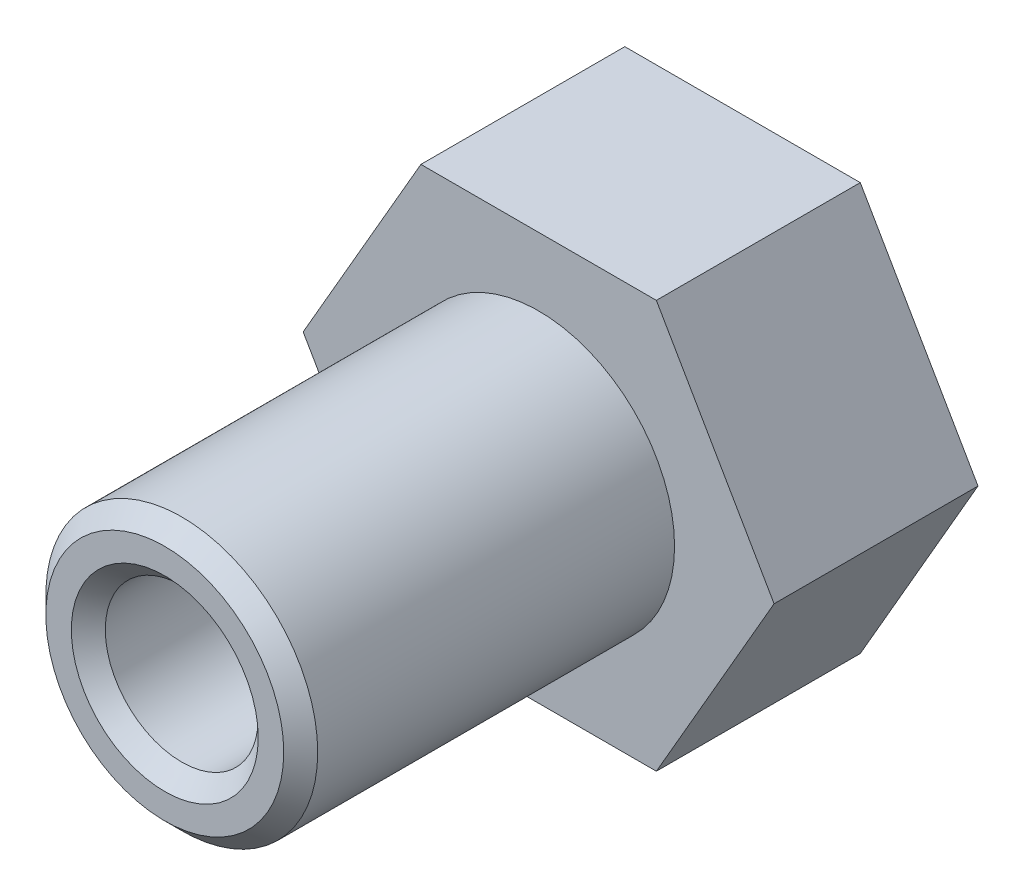
ISO-10303-21;
HEADER;
FILE_DESCRIPTION(('STEP AP214'),'2;1');
FILE_NAME('part.step','',(''),(''),'','','');
FILE_SCHEMA(('AUTOMOTIVE_DESIGN { 1 0 10303 214 1 1 1 1 }'));
ENDSEC;
DATA;
#1=APPLICATION_CONTEXT('core data for automotive mechanical design processes');
#2=APPLICATION_PROTOCOL_DEFINITION('international standard','automotive_design',2000,#1);
#3=PRODUCT_CONTEXT('',#1,'mechanical');
#4=PRODUCT('Part','Part','',(#3));
#5=PRODUCT_RELATED_PRODUCT_CATEGORY('part','',(#4));
#6=PRODUCT_DEFINITION_FORMATION('','',#4);
#7=PRODUCT_DEFINITION_CONTEXT('part definition',#1,'design');
#8=PRODUCT_DEFINITION('design','',#6,#7);
#9=PRODUCT_DEFINITION_SHAPE('','',#8);
#10=(LENGTH_UNIT() NAMED_UNIT(*) SI_UNIT(.MILLI.,.METRE.));
#11=(NAMED_UNIT(*) PLANE_ANGLE_UNIT() SI_UNIT($,.RADIAN.));
#12=(NAMED_UNIT(*) SI_UNIT($,.STERADIAN.) SOLID_ANGLE_UNIT());
#13=UNCERTAINTY_MEASURE_WITH_UNIT(LENGTH_MEASURE(1.E-05),#10,'distance_accuracy_value','');
#14=(GEOMETRIC_REPRESENTATION_CONTEXT(3) GLOBAL_UNCERTAINTY_ASSIGNED_CONTEXT((#13)) GLOBAL_UNIT_ASSIGNED_CONTEXT((#10,
#11,#12)) REPRESENTATION_CONTEXT('',''));
#15=CARTESIAN_POINT('',(0.,0.,0.));
#16=DIRECTION('',(0.,0.,1.));
#17=DIRECTION('',(1.,0.,0.));
#18=AXIS2_PLACEMENT_3D('',#15,#16,#17);
#19=CARTESIAN_POINT('',(-6.9282032302755,-12.,12.));
#20=DIRECTION('',(0.,0.,1.));
#21=DIRECTION('',(1.,0.,0.));
#22=AXIS2_PLACEMENT_3D('',#19,#20,#21);
#23=PLANE('',#22);
#24=DIRECTION('',(0.5,-0.866025403784438,0.));
#25=VECTOR('',#24,1.);
#26=CARTESIAN_POINT('',(-13.856406460551,0.,12.));
#27=LINE('',#26,#25);
#28=CARTESIAN_POINT('',(-13.856406460551,0.,12.));
#29=VERTEX_POINT('',#28);
#30=CARTESIAN_POINT('',(-6.9282032302755,-12.,12.));
#31=VERTEX_POINT('',#30);
#32=EDGE_CURVE('E131',#29,#31,#27,.T.);
#33=ORIENTED_EDGE('',*,*,#32,.T.);
#34=DIRECTION('',(1.,0.,0.));
#35=VECTOR('',#34,1.);
#36=CARTESIAN_POINT('',(-6.9282032302755,-12.,12.));
#37=LINE('',#36,#35);
#38=CARTESIAN_POINT('',(6.92820323027551,-12.,12.));
#39=VERTEX_POINT('',#38);
#40=EDGE_CURVE('E89',#31,#39,#37,.T.);
#41=ORIENTED_EDGE('',*,*,#40,.T.);
#42=DIRECTION('',(0.5,0.866025403784438,0.));
#43=VECTOR('',#42,1.);
#44=CARTESIAN_POINT('',(6.92820323027551,-12.,12.));
#45=LINE('',#44,#43);
#46=CARTESIAN_POINT('',(13.856406460551,0.,12.));
#47=VERTEX_POINT('',#46);
#48=EDGE_CURVE('E102',#39,#47,#45,.T.);
#49=ORIENTED_EDGE('',*,*,#48,.T.);
#50=DIRECTION('',(-0.5,0.866025403784438,0.));
#51=VECTOR('',#50,1.);
#52=CARTESIAN_POINT('',(13.856406460551,0.,12.));
#53=LINE('',#52,#51);
#54=CARTESIAN_POINT('',(6.9282032302755,12.,12.));
#55=VERTEX_POINT('',#54);
#56=EDGE_CURVE('E96',#47,#55,#53,.T.);
#57=ORIENTED_EDGE('',*,*,#56,.T.);
#58=DIRECTION('',(-1.,0.,0.));
#59=VECTOR('',#58,1.);
#60=CARTESIAN_POINT('',(6.9282032302755,12.,12.));
#61=LINE('',#60,#59);
#62=CARTESIAN_POINT('',(-6.92820323027551,12.,12.));
#63=VERTEX_POINT('',#62);
#64=EDGE_CURVE('E100',#55,#63,#61,.T.);
#65=ORIENTED_EDGE('',*,*,#64,.T.);
#66=DIRECTION('',(-0.5,-0.866025403784439,0.));
#67=VECTOR('',#66,1.);
#68=CARTESIAN_POINT('',(-6.92820323027551,12.,12.));
#69=LINE('',#68,#67);
#70=EDGE_CURVE('E51',#63,#29,#69,.T.);
#71=ORIENTED_EDGE('',*,*,#70,.T.);
#72=EDGE_LOOP('',(#33,#41,#49,#57,#65,#71));
#73=FACE_BOUND('',#72,.T.);
#74=CARTESIAN_POINT('',(0.,0.,12.));
#75=DIRECTION('',(0.,0.,1.));
#76=DIRECTION('',(1.,0.,0.));
#77=AXIS2_PLACEMENT_3D('',#74,#75,#76);
#78=CIRCLE('',#77,8.);
#79=CARTESIAN_POINT('',(8.,0.,12.));
#80=VERTEX_POINT('',#79);
#81=EDGE_CURVE('E124',#80,#80,#78,.T.);
#82=ORIENTED_EDGE('',*,*,#81,.F.);
#83=EDGE_LOOP('',(#82));
#84=FACE_BOUND('',#83,.T.);
#85=ADVANCED_FACE('F34',(#73,#84),#23,.T.);
#86=CARTESIAN_POINT('',(-13.856406460551,0.,12.));
#87=DIRECTION('',(0.866025403784439,0.5,0.));
#88=DIRECTION('',(-0.5,0.866025403784439,0.));
#89=AXIS2_PLACEMENT_3D('',#86,#87,#88);
#90=PLANE('',#89);
#91=DIRECTION('',(0.5,-0.866025403784438,0.));
#92=VECTOR('',#91,1.);
#93=CARTESIAN_POINT('',(-13.856406460551,0.,0.));
#94=LINE('',#93,#92);
#95=CARTESIAN_POINT('',(-13.856406460551,0.,0.));
#96=VERTEX_POINT('',#95);
#97=CARTESIAN_POINT('',(-6.9282032302755,-12.,0.));
#98=VERTEX_POINT('',#97);
#99=EDGE_CURVE('E120',#96,#98,#94,.T.);
#100=ORIENTED_EDGE('',*,*,#99,.T.);
#101=DIRECTION('',(0.,0.,-1.));
#102=VECTOR('',#101,1.);
#103=CARTESIAN_POINT('',(-6.9282032302755,-12.,12.));
#104=LINE('',#103,#102);
#105=EDGE_CURVE('E138',#31,#98,#104,.T.);
#106=ORIENTED_EDGE('',*,*,#105,.F.);
#107=ORIENTED_EDGE('',*,*,#32,.F.);
#108=DIRECTION('',(0.,0.,-1.));
#109=VECTOR('',#108,1.);
#110=CARTESIAN_POINT('',(-13.856406460551,0.,12.));
#111=LINE('',#110,#109);
#112=EDGE_CURVE('E116',#29,#96,#111,.T.);
#113=ORIENTED_EDGE('',*,*,#112,.T.);
#114=EDGE_LOOP('',(#100,#106,#107,#113));
#115=FACE_BOUND('',#114,.T.);
#116=ADVANCED_FACE('F161',(#115),#90,.F.);
#117=CARTESIAN_POINT('',(-6.9282032302755,-12.,12.));
#118=DIRECTION('',(0.,1.,0.));
#119=DIRECTION('',(-1.,0.,0.));
#120=AXIS2_PLACEMENT_3D('',#117,#118,#119);
#121=PLANE('',#120);
#122=DIRECTION('',(1.,0.,0.));
#123=VECTOR('',#122,1.);
#124=CARTESIAN_POINT('',(-6.9282032302755,-12.,0.));
#125=LINE('',#124,#123);
#126=CARTESIAN_POINT('',(6.92820323027551,-12.,0.));
#127=VERTEX_POINT('',#126);
#128=EDGE_CURVE('E123',#98,#127,#125,.T.);
#129=ORIENTED_EDGE('',*,*,#128,.T.);
#130=DIRECTION('',(0.,0.,-1.));
#131=VECTOR('',#130,1.);
#132=CARTESIAN_POINT('',(6.92820323027551,-12.,12.));
#133=LINE('',#132,#131);
#134=EDGE_CURVE('E135',#39,#127,#133,.T.);
#135=ORIENTED_EDGE('',*,*,#134,.F.);
#136=ORIENTED_EDGE('',*,*,#40,.F.);
#137=ORIENTED_EDGE('',*,*,#105,.T.);
#138=EDGE_LOOP('',(#129,#135,#136,#137));
#139=FACE_BOUND('',#138,.T.);
#140=ADVANCED_FACE('F166',(#139),#121,.F.);
#141=CARTESIAN_POINT('',(6.92820323027551,-12.,12.));
#142=DIRECTION('',(-0.866025403784439,0.5,0.));
#143=DIRECTION('',(-0.5,-0.866025403784439,0.));
#144=AXIS2_PLACEMENT_3D('',#141,#142,#143);
#145=PLANE('',#144);
#146=DIRECTION('',(0.5,0.866025403784438,0.));
#147=VECTOR('',#146,1.);
#148=CARTESIAN_POINT('',(6.92820323027551,-12.,0.));
#149=LINE('',#148,#147);
#150=CARTESIAN_POINT('',(13.856406460551,0.,0.));
#151=VERTEX_POINT('',#150);
#152=EDGE_CURVE('E126',#127,#151,#149,.T.);
#153=ORIENTED_EDGE('',*,*,#152,.T.);
#154=DIRECTION('',(0.,0.,-1.));
#155=VECTOR('',#154,1.);
#156=CARTESIAN_POINT('',(13.856406460551,0.,12.));
#157=LINE('',#156,#155);
#158=EDGE_CURVE('E111',#47,#151,#157,.T.);
#159=ORIENTED_EDGE('',*,*,#158,.F.);
#160=ORIENTED_EDGE('',*,*,#48,.F.);
#161=ORIENTED_EDGE('',*,*,#134,.T.);
#162=EDGE_LOOP('',(#153,#159,#160,#161));
#163=FACE_BOUND('',#162,.T.);
#164=ADVANCED_FACE('F184',(#163),#145,.F.);
#165=CARTESIAN_POINT('',(13.856406460551,0.,12.));
#166=DIRECTION('',(-0.866025403784438,-0.5,0.));
#167=DIRECTION('',(0.5,-0.866025403784439,0.));
#168=AXIS2_PLACEMENT_3D('',#165,#166,#167);
#169=PLANE('',#168);
#170=DIRECTION('',(-0.5,0.866025403784438,0.));
#171=VECTOR('',#170,1.);
#172=CARTESIAN_POINT('',(13.856406460551,0.,0.));
#173=LINE('',#172,#171);
#174=CARTESIAN_POINT('',(6.9282032302755,12.,0.));
#175=VERTEX_POINT('',#174);
#176=EDGE_CURVE('E110',#151,#175,#173,.T.);
#177=ORIENTED_EDGE('',*,*,#176,.T.);
#178=DIRECTION('',(0.,0.,-1.));
#179=VECTOR('',#178,1.);
#180=CARTESIAN_POINT('',(6.9282032302755,12.,12.));
#181=LINE('',#180,#179);
#182=EDGE_CURVE('E107',#55,#175,#181,.T.);
#183=ORIENTED_EDGE('',*,*,#182,.F.);
#184=ORIENTED_EDGE('',*,*,#56,.F.);
#185=ORIENTED_EDGE('',*,*,#158,.T.);
#186=EDGE_LOOP('',(#177,#183,#184,#185));
#187=FACE_BOUND('',#186,.T.);
#188=ADVANCED_FACE('F108',(#187),#169,.F.);
#189=CARTESIAN_POINT('',(6.9282032302755,12.,12.));
#190=DIRECTION('',(0.,-1.,0.));
#191=DIRECTION('',(1.,0.,0.));
#192=AXIS2_PLACEMENT_3D('',#189,#190,#191);
#193=PLANE('',#192);
#194=DIRECTION('',(-1.,0.,0.));
#195=VECTOR('',#194,1.);
#196=CARTESIAN_POINT('',(6.9282032302755,12.,0.));
#197=LINE('',#196,#195);
#198=CARTESIAN_POINT('',(-6.92820323027551,12.,0.));
#199=VERTEX_POINT('',#198);
#200=EDGE_CURVE('E74',#175,#199,#197,.T.);
#201=ORIENTED_EDGE('',*,*,#200,.T.);
#202=DIRECTION('',(0.,0.,-1.));
#203=VECTOR('',#202,1.);
#204=CARTESIAN_POINT('',(-6.92820323027551,12.,12.));
#205=LINE('',#204,#203);
#206=EDGE_CURVE('E112',#63,#199,#205,.T.);
#207=ORIENTED_EDGE('',*,*,#206,.F.);
#208=ORIENTED_EDGE('',*,*,#64,.F.);
#209=ORIENTED_EDGE('',*,*,#182,.T.);
#210=EDGE_LOOP('',(#201,#207,#208,#209));
#211=FACE_BOUND('',#210,.T.);
#212=ADVANCED_FACE('F114',(#211),#193,.F.);
#213=CARTESIAN_POINT('',(-6.92820323027551,12.,12.));
#214=DIRECTION('',(0.866025403784438,-0.5,0.));
#215=DIRECTION('',(0.5,0.866025403784439,0.));
#216=AXIS2_PLACEMENT_3D('',#213,#214,#215);
#217=PLANE('',#216);
#218=DIRECTION('',(-0.5,-0.866025403784439,0.));
#219=VECTOR('',#218,1.);
#220=CARTESIAN_POINT('',(-6.92820323027551,12.,0.));
#221=LINE('',#220,#219);
#222=EDGE_CURVE('E80',#199,#96,#221,.T.);
#223=ORIENTED_EDGE('',*,*,#222,.T.);
#224=ORIENTED_EDGE('',*,*,#112,.F.);
#225=ORIENTED_EDGE('',*,*,#70,.F.);
#226=ORIENTED_EDGE('',*,*,#206,.T.);
#227=EDGE_LOOP('',(#223,#224,#225,#226));
#228=FACE_BOUND('',#227,.T.);
#229=ADVANCED_FACE('F176',(#228),#217,.F.);
#230=CARTESIAN_POINT('',(-6.9282032302755,-12.,0.));
#231=DIRECTION('',(0.,0.,1.));
#232=DIRECTION('',(1.,0.,0.));
#233=AXIS2_PLACEMENT_3D('',#230,#231,#232);
#234=PLANE('',#233);
#235=CARTESIAN_POINT('',(0.,0.,0.));
#236=DIRECTION('',(0.,0.,-1.));
#237=DIRECTION('',(-1.,0.,0.));
#238=AXIS2_PLACEMENT_3D('',#235,#236,#237);
#239=CIRCLE('',#238,4.5);
#240=CARTESIAN_POINT('',(-4.5,0.,0.));
#241=VERTEX_POINT('',#240);
#242=EDGE_CURVE('E201',#241,#241,#239,.T.);
#243=ORIENTED_EDGE('',*,*,#242,.F.);
#244=EDGE_LOOP('',(#243));
#245=FACE_BOUND('',#244,.T.);
#246=ORIENTED_EDGE('',*,*,#99,.F.);
#247=ORIENTED_EDGE('',*,*,#222,.F.);
#248=ORIENTED_EDGE('',*,*,#200,.F.);
#249=ORIENTED_EDGE('',*,*,#176,.F.);
#250=ORIENTED_EDGE('',*,*,#152,.F.);
#251=ORIENTED_EDGE('',*,*,#128,.F.);
#252=EDGE_LOOP('',(#246,#247,#248,#249,#250,#251));
#253=FACE_BOUND('',#252,.T.);
#254=ADVANCED_FACE('F173',(#245,#253),#234,.F.);
#255=CARTESIAN_POINT('',(0.,0.,34.));
#256=DIRECTION('',(0.,0.,-1.));
#257=DIRECTION('',(-1.,0.,0.));
#258=AXIS2_PLACEMENT_3D('',#255,#256,#257);
#259=CYLINDRICAL_SURFACE('',#258,8.);
#260=CARTESIAN_POINT('',(0.,0.,33.));
#261=DIRECTION('',(0.,0.,1.));
#262=DIRECTION('',(1.,0.,0.));
#263=AXIS2_PLACEMENT_3D('',#260,#261,#262);
#264=CIRCLE('',#263,8.);
#265=CARTESIAN_POINT('',(8.,0.,33.));
#266=VERTEX_POINT('',#265);
#267=EDGE_CURVE('E143',#266,#266,#264,.F.);
#268=ORIENTED_EDGE('',*,*,#267,.T.);
#269=EDGE_LOOP('',(#268));
#270=FACE_BOUND('',#269,.T.);
#271=ORIENTED_EDGE('',*,*,#81,.T.);
#272=EDGE_LOOP('',(#271));
#273=FACE_BOUND('',#272,.T.);
#274=ADVANCED_FACE('F171',(#270,#273),#259,.T.);
#275=CARTESIAN_POINT('',(0.,0.,34.));
#276=DIRECTION('',(0.,0.,1.));
#277=DIRECTION('',(1.,0.,0.));
#278=AXIS2_PLACEMENT_3D('',#275,#276,#277);
#279=PLANE('',#278);
#280=CARTESIAN_POINT('',(0.,0.,34.));
#281=DIRECTION('',(0.,0.,1.));
#282=DIRECTION('',(1.,0.,0.));
#283=AXIS2_PLACEMENT_3D('',#280,#281,#282);
#284=CIRCLE('',#283,5.5);
#285=CARTESIAN_POINT('',(5.5,0.,34.));
#286=VERTEX_POINT('',#285);
#287=EDGE_CURVE('E43',#286,#286,#284,.F.);
#288=ORIENTED_EDGE('',*,*,#287,.T.);
#289=EDGE_LOOP('',(#288));
#290=FACE_BOUND('',#289,.T.);
#291=CARTESIAN_POINT('',(0.,0.,34.));
#292=DIRECTION('',(0.,0.,1.));
#293=DIRECTION('',(1.,0.,0.));
#294=AXIS2_PLACEMENT_3D('',#291,#292,#293);
#295=CIRCLE('',#294,7.);
#296=CARTESIAN_POINT('',(7.,0.,34.));
#297=VERTEX_POINT('',#296);
#298=EDGE_CURVE('E140',#297,#297,#295,.T.);
#299=ORIENTED_EDGE('',*,*,#298,.T.);
#300=EDGE_LOOP('',(#299));
#301=FACE_BOUND('',#300,.T.);
#302=ADVANCED_FACE('F148',(#290,#301),#279,.T.);
#303=CARTESIAN_POINT('',(0.,0.,34.));
#304=DIRECTION('',(0.,0.,-1.));
#305=DIRECTION('',(-1.,0.,0.));
#306=AXIS2_PLACEMENT_3D('',#303,#304,#305);
#307=CYLINDRICAL_SURFACE('',#306,4.5);
#308=CARTESIAN_POINT('',(0.,0.,33.));
#309=DIRECTION('',(0.,0.,1.));
#310=DIRECTION('',(1.,0.,0.));
#311=AXIS2_PLACEMENT_3D('',#308,#309,#310);
#312=CIRCLE('',#311,4.5);
#313=CARTESIAN_POINT('',(4.5,0.,33.));
#314=VERTEX_POINT('',#313);
#315=EDGE_CURVE('E11',#314,#314,#312,.T.);
#316=ORIENTED_EDGE('',*,*,#315,.T.);
#317=EDGE_LOOP('',(#316));
#318=FACE_BOUND('',#317,.T.);
#319=ORIENTED_EDGE('',*,*,#242,.T.);
#320=EDGE_LOOP('',(#319));
#321=FACE_BOUND('',#320,.T.);
#322=ADVANCED_FACE('F157',(#318,#321),#307,.F.);
#323=CARTESIAN_POINT('',(0.,0.,34.));
#324=DIRECTION('',(0.,0.,-1.));
#325=DIRECTION('',(-1.,0.,0.));
#326=AXIS2_PLACEMENT_3D('',#323,#324,#325);
#327=CONICAL_SURFACE('',#326,7.,0.785398163397445);
#328=ORIENTED_EDGE('',*,*,#267,.F.);
#329=EDGE_LOOP('',(#328));
#330=FACE_BOUND('',#329,.T.);
#331=ORIENTED_EDGE('',*,*,#298,.F.);
#332=EDGE_LOOP('',(#331));
#333=FACE_BOUND('',#332,.T.);
#334=ADVANCED_FACE('F152',(#330,#333),#327,.T.);
#335=CARTESIAN_POINT('',(0.,0.,34.));
#336=DIRECTION('',(0.,0.,1.));
#337=DIRECTION('',(1.,0.,0.));
#338=AXIS2_PLACEMENT_3D('',#335,#336,#337);
#339=CONICAL_SURFACE('',#338,5.5,0.785398163397447);
#340=ORIENTED_EDGE('',*,*,#315,.F.);
#341=EDGE_LOOP('',(#340));
#342=FACE_BOUND('',#341,.T.);
#343=ORIENTED_EDGE('',*,*,#287,.F.);
#344=EDGE_LOOP('',(#343));
#345=FACE_BOUND('',#344,.T.);
#346=ADVANCED_FACE('F36',(#342,#345),#339,.F.);
#347=CLOSED_SHELL('',(#85,#116,#140,#164,#188,#212,#229,#254,#274,#302,#322,#334,#346));
#348=MANIFOLD_SOLID_BREP('B2',#347);
#349=ADVANCED_BREP_SHAPE_REPRESENTATION('',(#18,#348),#14);
#350=SHAPE_DEFINITION_REPRESENTATION(#9,#349);
ENDSEC;
END-ISO-10303-21;
